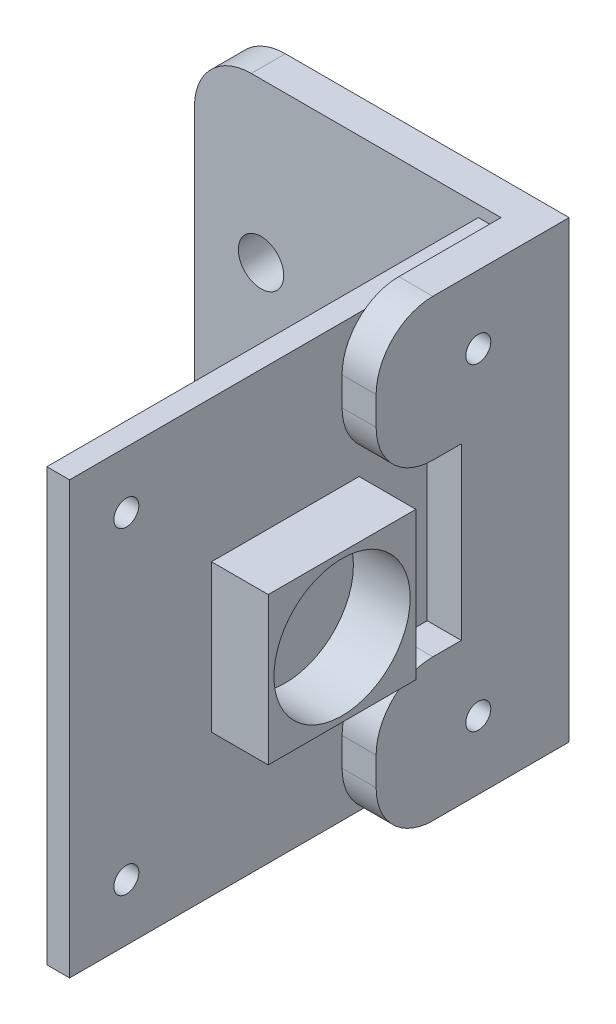
ISO-10303-21;
HEADER;
FILE_DESCRIPTION(('STEP AP214'),'2;1');
FILE_NAME('part.step','',(''),(''),'','','');
FILE_SCHEMA(('AUTOMOTIVE_DESIGN { 1 0 10303 214 1 1 1 1 }'));
ENDSEC;
DATA;
#1=APPLICATION_CONTEXT('core data for automotive mechanical design processes');
#2=APPLICATION_PROTOCOL_DEFINITION('international standard','automotive_design',2000,#1);
#3=PRODUCT_CONTEXT('',#1,'mechanical');
#4=PRODUCT('Part','Part','',(#3));
#5=PRODUCT_RELATED_PRODUCT_CATEGORY('part','',(#4));
#6=PRODUCT_DEFINITION_FORMATION('','',#4);
#7=PRODUCT_DEFINITION_CONTEXT('part definition',#1,'design');
#8=PRODUCT_DEFINITION('design','',#6,#7);
#9=PRODUCT_DEFINITION_SHAPE('','',#8);
#10=(LENGTH_UNIT() NAMED_UNIT(*) SI_UNIT(.MILLI.,.METRE.));
#11=(NAMED_UNIT(*) PLANE_ANGLE_UNIT() SI_UNIT($,.RADIAN.));
#12=(NAMED_UNIT(*) SI_UNIT($,.STERADIAN.) SOLID_ANGLE_UNIT());
#13=UNCERTAINTY_MEASURE_WITH_UNIT(LENGTH_MEASURE(1.E-05),#10,'distance_accuracy_value','');
#14=(GEOMETRIC_REPRESENTATION_CONTEXT(3) GLOBAL_UNCERTAINTY_ASSIGNED_CONTEXT((#13)) GLOBAL_UNIT_ASSIGNED_CONTEXT((#10,
#11,#12)) REPRESENTATION_CONTEXT('',''));
#15=CARTESIAN_POINT('',(0.,0.,0.));
#16=DIRECTION('',(0.,0.,1.));
#17=DIRECTION('',(1.,0.,0.));
#18=AXIS2_PLACEMENT_3D('',#15,#16,#17);
#19=CARTESIAN_POINT('',(5.,0.,-12.5));
#20=DIRECTION('',(0.,0.,-1.));
#21=DIRECTION('',(0.,1.,0.));
#22=AXIS2_PLACEMENT_3D('',#19,#20,#21);
#23=PLANE('',#22);
#24=DIRECTION('',(0.,-1.,0.));
#25=VECTOR('',#24,1.);
#26=CARTESIAN_POINT('',(2.,0.,-12.5));
#27=LINE('',#26,#25);
#28=CARTESIAN_POINT('',(2.,7.5,-12.5));
#29=VERTEX_POINT('',#28);
#30=CARTESIAN_POINT('',(2.,-7.5,-12.5));
#31=VERTEX_POINT('',#30);
#32=EDGE_CURVE('E258',#29,#31,#27,.T.);
#33=ORIENTED_EDGE('',*,*,#32,.T.);
#34=DIRECTION('',(-1.,0.,0.));
#35=VECTOR('',#34,1.);
#36=CARTESIAN_POINT('',(5.,-7.5,-12.5));
#37=LINE('',#36,#35);
#38=CARTESIAN_POINT('',(5.,-7.5,-12.5));
#39=VERTEX_POINT('',#38);
#40=EDGE_CURVE('E196',#39,#31,#37,.T.);
#41=ORIENTED_EDGE('',*,*,#40,.F.);
#42=DIRECTION('',(0.,-1.,0.));
#43=VECTOR('',#42,1.);
#44=CARTESIAN_POINT('',(5.,0.,-12.5));
#45=LINE('',#44,#43);
#46=CARTESIAN_POINT('',(5.,7.5,-12.5));
#47=VERTEX_POINT('',#46);
#48=EDGE_CURVE('E308',#47,#39,#45,.T.);
#49=ORIENTED_EDGE('',*,*,#48,.F.);
#50=DIRECTION('',(-1.,0.,0.));
#51=VECTOR('',#50,1.);
#52=CARTESIAN_POINT('',(5.,7.5,-12.5));
#53=LINE('',#52,#51);
#54=EDGE_CURVE('E268',#47,#29,#53,.T.);
#55=ORIENTED_EDGE('',*,*,#54,.T.);
#56=EDGE_LOOP('',(#33,#41,#49,#55));
#57=FACE_BOUND('',#56,.T.);
#58=ADVANCED_FACE('F53',(#57),#23,.F.);
#59=CARTESIAN_POINT('',(5.,-7.5,0.));
#60=DIRECTION('',(0.,-1.,0.));
#61=DIRECTION('',(0.,0.,-1.));
#62=AXIS2_PLACEMENT_3D('',#59,#60,#61);
#63=PLANE('',#62);
#64=DIRECTION('',(0.,0.,1.));
#65=VECTOR('',#64,1.);
#66=CARTESIAN_POINT('',(2.,-7.5,0.));
#67=LINE('',#66,#65);
#68=CARTESIAN_POINT('',(2.,-7.5,-10.));
#69=VERTEX_POINT('',#68);
#70=EDGE_CURVE('E328',#31,#69,#67,.T.);
#71=ORIENTED_EDGE('',*,*,#70,.T.);
#72=DIRECTION('',(-1.,0.,0.));
#73=VECTOR('',#72,1.);
#74=CARTESIAN_POINT('',(5.,-7.5,-10.));
#75=LINE('',#74,#73);
#76=CARTESIAN_POINT('',(5.,-7.5,-10.));
#77=VERTEX_POINT('',#76);
#78=EDGE_CURVE('E12',#69,#77,#75,.F.);
#79=ORIENTED_EDGE('',*,*,#78,.T.);
#80=DIRECTION('',(0.,0.,1.));
#81=VECTOR('',#80,1.);
#82=CARTESIAN_POINT('',(5.,-7.5,0.));
#83=LINE('',#82,#81);
#84=EDGE_CURVE('E311',#39,#77,#83,.T.);
#85=ORIENTED_EDGE('',*,*,#84,.F.);
#86=ORIENTED_EDGE('',*,*,#40,.T.);
#87=EDGE_LOOP('',(#71,#79,#85,#86));
#88=FACE_BOUND('',#87,.T.);
#89=ADVANCED_FACE('F351',(#88),#63,.F.);
#90=CARTESIAN_POINT('',(5.,0.,-5.));
#91=DIRECTION('',(0.,0.,1.));
#92=DIRECTION('',(1.,0.,0.));
#93=AXIS2_PLACEMENT_3D('',#90,#91,#92);
#94=PLANE('',#93);
#95=DIRECTION('',(0.,1.,0.));
#96=VECTOR('',#95,1.);
#97=CARTESIAN_POINT('',(2.,0.,-5.));
#98=LINE('',#97,#96);
#99=CARTESIAN_POINT('',(2.,-15.,-5.));
#100=VERTEX_POINT('',#99);
#101=CARTESIAN_POINT('',(2.,-12.5,-5.));
#102=VERTEX_POINT('',#101);
#103=EDGE_CURVE('E265',#100,#102,#98,.T.);
#104=ORIENTED_EDGE('',*,*,#103,.F.);
#105=DIRECTION('',(-1.,0.,0.));
#106=VECTOR('',#105,1.);
#107=CARTESIAN_POINT('',(5.,-15.,-5.));
#108=LINE('',#107,#106);
#109=CARTESIAN_POINT('',(5.,-15.,-5.));
#110=VERTEX_POINT('',#109);
#111=EDGE_CURVE('E233',#100,#110,#108,.F.);
#112=ORIENTED_EDGE('',*,*,#111,.T.);
#113=DIRECTION('',(0.,1.,0.));
#114=VECTOR('',#113,1.);
#115=CARTESIAN_POINT('',(5.,0.,-5.));
#116=LINE('',#115,#114);
#117=CARTESIAN_POINT('',(5.,-12.5,-5.));
#118=VERTEX_POINT('',#117);
#119=EDGE_CURVE('E313',#110,#118,#116,.T.);
#120=ORIENTED_EDGE('',*,*,#119,.T.);
#121=DIRECTION('',(-1.,0.,0.));
#122=VECTOR('',#121,1.);
#123=CARTESIAN_POINT('',(2.,-12.5,-5.));
#124=LINE('',#123,#122);
#125=EDGE_CURVE('E230',#118,#102,#124,.T.);
#126=ORIENTED_EDGE('',*,*,#125,.T.);
#127=EDGE_LOOP('',(#104,#112,#120,#126));
#128=FACE_BOUND('',#127,.T.);
#129=ADVANCED_FACE('F333',(#128),#94,.T.);
#130=CARTESIAN_POINT('',(5.,-20.,0.));
#131=DIRECTION('',(0.,1.,0.));
#132=DIRECTION('',(0.,0.,1.));
#133=AXIS2_PLACEMENT_3D('',#130,#131,#132);
#134=PLANE('',#133);
#135=DIRECTION('',(1.,0.,0.));
#136=VECTOR('',#135,1.);
#137=CARTESIAN_POINT('',(-25.,-20.,-19.));
#138=LINE('',#137,#136);
#139=CARTESIAN_POINT('',(-20.,-20.,-19.));
#140=VERTEX_POINT('',#139);
#141=CARTESIAN_POINT('',(2.,-20.,-19.));
#142=VERTEX_POINT('',#141);
#143=EDGE_CURVE('E188',#140,#142,#138,.T.);
#144=ORIENTED_EDGE('',*,*,#143,.F.);
#145=DIRECTION('',(0.,0.,-1.));
#146=VECTOR('',#145,1.);
#147=CARTESIAN_POINT('',(-20.,-20.,0.));
#148=LINE('',#147,#146);
#149=CARTESIAN_POINT('',(-20.,-20.,-22.));
#150=VERTEX_POINT('',#149);
#151=EDGE_CURVE('E199',#140,#150,#148,.T.);
#152=ORIENTED_EDGE('',*,*,#151,.T.);
#153=DIRECTION('',(-1.,0.,0.));
#154=VECTOR('',#153,1.);
#155=CARTESIAN_POINT('',(5.,-20.,-22.));
#156=LINE('',#155,#154);
#157=CARTESIAN_POINT('',(5.,-20.,-22.));
#158=VERTEX_POINT('',#157);
#159=EDGE_CURVE('E202',#158,#150,#156,.T.);
#160=ORIENTED_EDGE('',*,*,#159,.F.);
#161=DIRECTION('',(0.,0.,-1.));
#162=VECTOR('',#161,1.);
#163=CARTESIAN_POINT('',(5.,-20.,0.));
#164=LINE('',#163,#162);
#165=CARTESIAN_POINT('',(5.,-20.,-10.));
#166=VERTEX_POINT('',#165);
#167=EDGE_CURVE('E284',#166,#158,#164,.T.);
#168=ORIENTED_EDGE('',*,*,#167,.F.);
#169=DIRECTION('',(-1.,0.,0.));
#170=VECTOR('',#169,1.);
#171=CARTESIAN_POINT('',(2.,-20.,-10.));
#172=LINE('',#171,#170);
#173=CARTESIAN_POINT('',(2.,-20.,-10.));
#174=VERTEX_POINT('',#173);
#175=EDGE_CURVE('E195',#166,#174,#172,.T.);
#176=ORIENTED_EDGE('',*,*,#175,.T.);
#177=DIRECTION('',(0.,0.,-1.));
#178=VECTOR('',#177,1.);
#179=CARTESIAN_POINT('',(2.,-20.,0.));
#180=LINE('',#179,#178);
#181=EDGE_CURVE('E178',#174,#142,#180,.T.);
#182=ORIENTED_EDGE('',*,*,#181,.T.);
#183=EDGE_LOOP('',(#144,#152,#160,#168,#176,#182));
#184=FACE_BOUND('',#183,.T.);
#185=ADVANCED_FACE('F283',(#184),#134,.F.);
#186=CARTESIAN_POINT('',(5.,0.,-22.));
#187=DIRECTION('',(0.,0.,1.));
#188=DIRECTION('',(1.,0.,0.));
#189=AXIS2_PLACEMENT_3D('',#186,#187,#188);
#190=PLANE('',#189);
#191=CARTESIAN_POINT('',(-19.1350052544408,6.,-22.));
#192=DIRECTION('',(0.,0.,1.));
#193=DIRECTION('',(1.,0.,0.));
#194=AXIS2_PLACEMENT_3D('',#191,#192,#193);
#195=CIRCLE('',#194,2.);
#196=CARTESIAN_POINT('',(-17.1350052544408,6.,-22.));
#197=VERTEX_POINT('',#196);
#198=EDGE_CURVE('E296',#197,#197,#195,.T.);
#199=ORIENTED_EDGE('',*,*,#198,.T.);
#200=EDGE_LOOP('',(#199));
#201=FACE_BOUND('',#200,.T.);
#202=CARTESIAN_POINT('',(-19.1350052544408,-6.,-22.));
#203=DIRECTION('',(0.,0.,1.));
#204=DIRECTION('',(1.,0.,0.));
#205=AXIS2_PLACEMENT_3D('',#202,#203,#204);
#206=CIRCLE('',#205,2.);
#207=CARTESIAN_POINT('',(-17.1350052544408,-6.,-22.));
#208=VERTEX_POINT('',#207);
#209=EDGE_CURVE('E300',#208,#208,#206,.T.);
#210=ORIENTED_EDGE('',*,*,#209,.T.);
#211=EDGE_LOOP('',(#210));
#212=FACE_BOUND('',#211,.T.);
#213=ORIENTED_EDGE('',*,*,#159,.T.);
#214=CARTESIAN_POINT('',(-20.,-15.,-22.));
#215=DIRECTION('',(0.,0.,1.));
#216=DIRECTION('',(1.,0.,0.));
#217=AXIS2_PLACEMENT_3D('',#214,#215,#216);
#218=CIRCLE('',#217,5.);
#219=CARTESIAN_POINT('',(-25.,-15.,-22.));
#220=VERTEX_POINT('',#219);
#221=EDGE_CURVE('E210',#150,#220,#218,.F.);
#222=ORIENTED_EDGE('',*,*,#221,.T.);
#223=DIRECTION('',(0.,1.,0.));
#224=VECTOR('',#223,1.);
#225=CARTESIAN_POINT('',(-25.,20.,-22.));
#226=LINE('',#225,#224);
#227=CARTESIAN_POINT('',(-25.,15.,-22.));
#228=VERTEX_POINT('',#227);
#229=EDGE_CURVE('E189',#220,#228,#226,.T.);
#230=ORIENTED_EDGE('',*,*,#229,.T.);
#231=CARTESIAN_POINT('',(-20.,15.,-22.));
#232=DIRECTION('',(0.,0.,1.));
#233=DIRECTION('',(1.,0.,0.));
#234=AXIS2_PLACEMENT_3D('',#231,#232,#233);
#235=CIRCLE('',#234,5.);
#236=CARTESIAN_POINT('',(-20.,20.,-22.));
#237=VERTEX_POINT('',#236);
#238=EDGE_CURVE('E208',#228,#237,#235,.F.);
#239=ORIENTED_EDGE('',*,*,#238,.T.);
#240=DIRECTION('',(-1.,0.,0.));
#241=VECTOR('',#240,1.);
#242=CARTESIAN_POINT('',(5.,20.,-22.));
#243=LINE('',#242,#241);
#244=CARTESIAN_POINT('',(5.,20.,-22.));
#245=VERTEX_POINT('',#244);
#246=EDGE_CURVE('E270',#245,#237,#243,.T.);
#247=ORIENTED_EDGE('',*,*,#246,.F.);
#248=DIRECTION('',(0.,1.,0.));
#249=VECTOR('',#248,1.);
#250=CARTESIAN_POINT('',(5.,0.,-22.));
#251=LINE('',#250,#249);
#252=EDGE_CURVE('E280',#158,#245,#251,.T.);
#253=ORIENTED_EDGE('',*,*,#252,.F.);
#254=EDGE_LOOP('',(#213,#222,#230,#239,#247,#253));
#255=FACE_BOUND('',#254,.T.);
#256=ADVANCED_FACE('F275',(#201,#212,#255),#190,.F.);
#257=CARTESIAN_POINT('',(5.,20.,0.));
#258=DIRECTION('',(0.,1.,0.));
#259=DIRECTION('',(0.,0.,1.));
#260=AXIS2_PLACEMENT_3D('',#257,#258,#259);
#261=PLANE('',#260);
#262=ORIENTED_EDGE('',*,*,#246,.T.);
#263=DIRECTION('',(0.,0.,1.));
#264=VECTOR('',#263,1.);
#265=CARTESIAN_POINT('',(-20.,20.,-19.));
#266=LINE('',#265,#264);
#267=CARTESIAN_POINT('',(-20.,20.,-19.));
#268=VERTEX_POINT('',#267);
#269=EDGE_CURVE('E186',#237,#268,#266,.T.);
#270=ORIENTED_EDGE('',*,*,#269,.T.);
#271=DIRECTION('',(1.,0.,0.));
#272=VECTOR('',#271,1.);
#273=CARTESIAN_POINT('',(-25.,20.,-19.));
#274=LINE('',#273,#272);
#275=CARTESIAN_POINT('',(2.,20.,-19.));
#276=VERTEX_POINT('',#275);
#277=EDGE_CURVE('E182',#268,#276,#274,.T.);
#278=ORIENTED_EDGE('',*,*,#277,.T.);
#279=DIRECTION('',(0.,0.,-1.));
#280=VECTOR('',#279,1.);
#281=CARTESIAN_POINT('',(2.,20.,0.));
#282=LINE('',#281,#280);
#283=CARTESIAN_POINT('',(2.,20.,-10.));
#284=VERTEX_POINT('',#283);
#285=EDGE_CURVE('E167',#284,#276,#282,.T.);
#286=ORIENTED_EDGE('',*,*,#285,.F.);
#287=DIRECTION('',(-1.,0.,0.));
#288=VECTOR('',#287,1.);
#289=CARTESIAN_POINT('',(5.,20.,-10.));
#290=LINE('',#289,#288);
#291=CARTESIAN_POINT('',(5.,20.,-10.));
#292=VERTEX_POINT('',#291);
#293=EDGE_CURVE('E220',#284,#292,#290,.F.);
#294=ORIENTED_EDGE('',*,*,#293,.T.);
#295=DIRECTION('',(0.,0.,-1.));
#296=VECTOR('',#295,1.);
#297=CARTESIAN_POINT('',(5.,20.,0.));
#298=LINE('',#297,#296);
#299=EDGE_CURVE('E317',#292,#245,#298,.T.);
#300=ORIENTED_EDGE('',*,*,#299,.T.);
#301=EDGE_LOOP('',(#262,#270,#278,#286,#294,#300));
#302=FACE_BOUND('',#301,.T.);
#303=ADVANCED_FACE('F184',(#302),#261,.T.);
#304=CARTESIAN_POINT('',(5.,12.5,-5.));
#305=VERTEX_POINT('',#304);
#306=CARTESIAN_POINT('',(5.,15.,-5.));
#307=VERTEX_POINT('',#306);
#308=EDGE_CURVE('E314',#305,#307,#116,.T.);
#309=ORIENTED_EDGE('',*,*,#308,.T.);
#310=DIRECTION('',(-1.,0.,0.));
#311=VECTOR('',#310,1.);
#312=CARTESIAN_POINT('',(5.,15.,-5.));
#313=LINE('',#312,#311);
#314=CARTESIAN_POINT('',(2.,15.,-5.));
#315=VERTEX_POINT('',#314);
#316=EDGE_CURVE('E244',#307,#315,#313,.T.);
#317=ORIENTED_EDGE('',*,*,#316,.T.);
#318=CARTESIAN_POINT('',(2.,12.5,-5.));
#319=VERTEX_POINT('',#318);
#320=EDGE_CURVE('E177',#319,#315,#98,.T.);
#321=ORIENTED_EDGE('',*,*,#320,.F.);
#322=DIRECTION('',(-1.,0.,0.));
#323=VECTOR('',#322,1.);
#324=CARTESIAN_POINT('',(5.,12.5,-5.));
#325=LINE('',#324,#323);
#326=EDGE_CURVE('E242',#319,#305,#325,.F.);
#327=ORIENTED_EDGE('',*,*,#326,.T.);
#328=EDGE_LOOP('',(#309,#317,#321,#327));
#329=FACE_BOUND('',#328,.T.);
#330=ADVANCED_FACE('F364',(#329),#94,.T.);
#331=CARTESIAN_POINT('',(5.,14.,-14.));
#332=DIRECTION('',(-1.,0.,0.));
#333=DIRECTION('',(0.,0.,1.));
#334=AXIS2_PLACEMENT_3D('',#331,#332,#333);
#335=CYLINDRICAL_SURFACE('',#334,1.1);
#336=CARTESIAN_POINT('',(5.,14.,-14.));
#337=DIRECTION('',(1.,0.,0.));
#338=DIRECTION('',(0.,0.,-1.));
#339=AXIS2_PLACEMENT_3D('',#336,#337,#338);
#340=CIRCLE('',#339,1.1);
#341=CARTESIAN_POINT('',(5.,14.,-15.1));
#342=VERTEX_POINT('',#341);
#343=EDGE_CURVE('E262',#342,#342,#340,.F.);
#344=ORIENTED_EDGE('',*,*,#343,.F.);
#345=EDGE_LOOP('',(#344));
#346=FACE_BOUND('',#345,.T.);
#347=CARTESIAN_POINT('',(2.,14.,-14.));
#348=DIRECTION('',(1.,0.,0.));
#349=DIRECTION('',(0.,0.,-1.));
#350=AXIS2_PLACEMENT_3D('',#347,#348,#349);
#351=CIRCLE('',#350,1.1);
#352=CARTESIAN_POINT('',(2.,14.,-15.1));
#353=VERTEX_POINT('',#352);
#354=EDGE_CURVE('E324',#353,#353,#351,.F.);
#355=ORIENTED_EDGE('',*,*,#354,.T.);
#356=EDGE_LOOP('',(#355));
#357=FACE_BOUND('',#356,.T.);
#358=ADVANCED_FACE('F361',(#346,#357),#335,.F.);
#359=CARTESIAN_POINT('',(5.,-14.,-14.));
#360=DIRECTION('',(-1.,0.,0.));
#361=DIRECTION('',(0.,0.,1.));
#362=AXIS2_PLACEMENT_3D('',#359,#360,#361);
#363=CYLINDRICAL_SURFACE('',#362,1.1);
#364=CARTESIAN_POINT('',(5.,-14.,-14.));
#365=DIRECTION('',(1.,0.,0.));
#366=DIRECTION('',(0.,0.,-1.));
#367=AXIS2_PLACEMENT_3D('',#364,#365,#366);
#368=CIRCLE('',#367,1.1);
#369=CARTESIAN_POINT('',(5.,-14.,-15.1));
#370=VERTEX_POINT('',#369);
#371=EDGE_CURVE('E259',#370,#370,#368,.F.);
#372=ORIENTED_EDGE('',*,*,#371,.F.);
#373=EDGE_LOOP('',(#372));
#374=FACE_BOUND('',#373,.T.);
#375=CARTESIAN_POINT('',(2.,-14.,-14.));
#376=DIRECTION('',(1.,0.,0.));
#377=DIRECTION('',(0.,0.,-1.));
#378=AXIS2_PLACEMENT_3D('',#375,#376,#377);
#379=CIRCLE('',#378,1.1);
#380=CARTESIAN_POINT('',(2.,-14.,-15.1));
#381=VERTEX_POINT('',#380);
#382=EDGE_CURVE('E304',#381,#381,#379,.F.);
#383=ORIENTED_EDGE('',*,*,#382,.T.);
#384=EDGE_LOOP('',(#383));
#385=FACE_BOUND('',#384,.T.);
#386=ADVANCED_FACE('F363',(#374,#385),#363,.F.);
#387=CARTESIAN_POINT('',(5.,7.5,0.));
#388=DIRECTION('',(0.,-1.,0.));
#389=DIRECTION('',(0.,0.,-1.));
#390=AXIS2_PLACEMENT_3D('',#387,#388,#389);
#391=PLANE('',#390);
#392=DIRECTION('',(0.,0.,1.));
#393=VECTOR('',#392,1.);
#394=CARTESIAN_POINT('',(5.,7.5,0.));
#395=LINE('',#394,#393);
#396=CARTESIAN_POINT('',(5.,7.5,-10.));
#397=VERTEX_POINT('',#396);
#398=EDGE_CURVE('E253',#47,#397,#395,.T.);
#399=ORIENTED_EDGE('',*,*,#398,.T.);
#400=DIRECTION('',(-1.,0.,0.));
#401=VECTOR('',#400,1.);
#402=CARTESIAN_POINT('',(5.,7.5,-10.));
#403=LINE('',#402,#401);
#404=CARTESIAN_POINT('',(2.,7.5,-10.));
#405=VERTEX_POINT('',#404);
#406=EDGE_CURVE('E61',#397,#405,#403,.T.);
#407=ORIENTED_EDGE('',*,*,#406,.T.);
#408=DIRECTION('',(0.,0.,1.));
#409=VECTOR('',#408,1.);
#410=CARTESIAN_POINT('',(2.,7.5,0.));
#411=LINE('',#410,#409);
#412=EDGE_CURVE('E252',#29,#405,#411,.T.);
#413=ORIENTED_EDGE('',*,*,#412,.F.);
#414=ORIENTED_EDGE('',*,*,#54,.F.);
#415=EDGE_LOOP('',(#399,#407,#413,#414));
#416=FACE_BOUND('',#415,.T.);
#417=ADVANCED_FACE('F251',(#416),#391,.T.);
#418=CARTESIAN_POINT('',(5.,0.,0.));
#419=DIRECTION('',(1.,0.,0.));
#420=DIRECTION('',(0.,0.,-1.));
#421=AXIS2_PLACEMENT_3D('',#418,#419,#420);
#422=PLANE('',#421);
#423=ORIENTED_EDGE('',*,*,#119,.F.);
#424=CARTESIAN_POINT('',(5.,-15.,-10.));
#425=DIRECTION('',(1.,0.,0.));
#426=DIRECTION('',(0.,0.,-1.));
#427=AXIS2_PLACEMENT_3D('',#424,#425,#426);
#428=CIRCLE('',#427,5.);
#429=EDGE_CURVE('E240',#110,#166,#428,.T.);
#430=ORIENTED_EDGE('',*,*,#429,.T.);
#431=ORIENTED_EDGE('',*,*,#167,.T.);
#432=ORIENTED_EDGE('',*,*,#252,.T.);
#433=ORIENTED_EDGE('',*,*,#299,.F.);
#434=CARTESIAN_POINT('',(5.,15.,-10.));
#435=DIRECTION('',(1.,0.,0.));
#436=DIRECTION('',(0.,0.,-1.));
#437=AXIS2_PLACEMENT_3D('',#434,#435,#436);
#438=CIRCLE('',#437,5.);
#439=EDGE_CURVE('E238',#292,#307,#438,.T.);
#440=ORIENTED_EDGE('',*,*,#439,.T.);
#441=ORIENTED_EDGE('',*,*,#308,.F.);
#442=CARTESIAN_POINT('',(5.,12.5,-10.));
#443=DIRECTION('',(1.,0.,0.));
#444=DIRECTION('',(0.,0.,-1.));
#445=AXIS2_PLACEMENT_3D('',#442,#443,#444);
#446=CIRCLE('',#445,5.);
#447=EDGE_CURVE('E74',#305,#397,#446,.T.);
#448=ORIENTED_EDGE('',*,*,#447,.T.);
#449=ORIENTED_EDGE('',*,*,#398,.F.);
#450=ORIENTED_EDGE('',*,*,#48,.T.);
#451=ORIENTED_EDGE('',*,*,#84,.T.);
#452=CARTESIAN_POINT('',(5.,-12.5,-10.));
#453=DIRECTION('',(1.,0.,0.));
#454=DIRECTION('',(0.,0.,-1.));
#455=AXIS2_PLACEMENT_3D('',#452,#453,#454);
#456=CIRCLE('',#455,5.);
#457=EDGE_CURVE('E235',#77,#118,#456,.T.);
#458=ORIENTED_EDGE('',*,*,#457,.T.);
#459=EDGE_LOOP('',(#423,#430,#431,#432,#433,#440,#441,#448,#449,#450,#451,#458));
#460=FACE_BOUND('',#459,.T.);
#461=ORIENTED_EDGE('',*,*,#371,.T.);
#462=EDGE_LOOP('',(#461));
#463=FACE_BOUND('',#462,.T.);
#464=ORIENTED_EDGE('',*,*,#343,.T.);
#465=EDGE_LOOP('',(#464));
#466=FACE_BOUND('',#465,.T.);
#467=ADVANCED_FACE('F340',(#460,#463,#466),#422,.T.);
#468=CARTESIAN_POINT('',(2.,0.,0.));
#469=DIRECTION('',(1.,0.,0.));
#470=DIRECTION('',(0.,0.,-1.));
#471=AXIS2_PLACEMENT_3D('',#468,#469,#470);
#472=PLANE('',#471);
#473=ORIENTED_EDGE('',*,*,#382,.F.);
#474=EDGE_LOOP('',(#473));
#475=FACE_BOUND('',#474,.T.);
#476=ORIENTED_EDGE('',*,*,#354,.F.);
#477=EDGE_LOOP('',(#476));
#478=FACE_BOUND('',#477,.T.);
#479=ORIENTED_EDGE('',*,*,#181,.F.);
#480=CARTESIAN_POINT('',(2.,-15.,-10.));
#481=DIRECTION('',(1.,0.,0.));
#482=DIRECTION('',(0.,0.,-1.));
#483=AXIS2_PLACEMENT_3D('',#480,#481,#482);
#484=CIRCLE('',#483,5.);
#485=EDGE_CURVE('E228',#174,#100,#484,.F.);
#486=ORIENTED_EDGE('',*,*,#485,.T.);
#487=ORIENTED_EDGE('',*,*,#103,.T.);
#488=CARTESIAN_POINT('',(2.,-12.5,-10.));
#489=DIRECTION('',(1.,0.,0.));
#490=DIRECTION('',(0.,0.,-1.));
#491=AXIS2_PLACEMENT_3D('',#488,#489,#490);
#492=CIRCLE('',#491,5.);
#493=EDGE_CURVE('E223',#102,#69,#492,.F.);
#494=ORIENTED_EDGE('',*,*,#493,.T.);
#495=ORIENTED_EDGE('',*,*,#70,.F.);
#496=ORIENTED_EDGE('',*,*,#32,.F.);
#497=ORIENTED_EDGE('',*,*,#412,.T.);
#498=CARTESIAN_POINT('',(2.,12.5,-10.));
#499=DIRECTION('',(1.,0.,0.));
#500=DIRECTION('',(0.,0.,-1.));
#501=AXIS2_PLACEMENT_3D('',#498,#499,#500);
#502=CIRCLE('',#501,5.);
#503=EDGE_CURVE('E225',#405,#319,#502,.F.);
#504=ORIENTED_EDGE('',*,*,#503,.T.);
#505=ORIENTED_EDGE('',*,*,#320,.T.);
#506=CARTESIAN_POINT('',(2.,15.,-10.));
#507=DIRECTION('',(1.,0.,0.));
#508=DIRECTION('',(0.,0.,-1.));
#509=AXIS2_PLACEMENT_3D('',#506,#507,#508);
#510=CIRCLE('',#509,5.);
#511=EDGE_CURVE('E174',#315,#284,#510,.F.);
#512=ORIENTED_EDGE('',*,*,#511,.T.);
#513=ORIENTED_EDGE('',*,*,#285,.T.);
#514=DIRECTION('',(0.,-1.,0.));
#515=VECTOR('',#514,1.);
#516=CARTESIAN_POINT('',(2.,0.,-19.));
#517=LINE('',#516,#515);
#518=EDGE_CURVE('E172',#276,#142,#517,.T.);
#519=ORIENTED_EDGE('',*,*,#518,.T.);
#520=EDGE_LOOP('',(#479,#486,#487,#494,#495,#496,#497,#504,#505,#512,#513,#519));
#521=FACE_BOUND('',#520,.T.);
#522=ADVANCED_FACE('F170',(#475,#478,#521),#472,.F.);
#523=CARTESIAN_POINT('',(-25.,20.,-19.));
#524=DIRECTION('',(0.,0.,1.));
#525=DIRECTION('',(0.,-1.,0.));
#526=AXIS2_PLACEMENT_3D('',#523,#524,#525);
#527=PLANE('',#526);
#528=CARTESIAN_POINT('',(-19.1350052544408,6.,-19.));
#529=DIRECTION('',(0.,0.,1.));
#530=DIRECTION('',(1.,0.,0.));
#531=AXIS2_PLACEMENT_3D('',#528,#529,#530);
#532=CIRCLE('',#531,2.);
#533=CARTESIAN_POINT('',(-17.1350052544408,6.,-19.));
#534=VERTEX_POINT('',#533);
#535=EDGE_CURVE('E411',#534,#534,#532,.T.);
#536=ORIENTED_EDGE('',*,*,#535,.F.);
#537=EDGE_LOOP('',(#536));
#538=FACE_BOUND('',#537,.T.);
#539=CARTESIAN_POINT('',(-19.1350052544408,-6.,-19.));
#540=DIRECTION('',(0.,0.,1.));
#541=DIRECTION('',(1.,0.,0.));
#542=AXIS2_PLACEMENT_3D('',#539,#540,#541);
#543=CIRCLE('',#542,2.);
#544=CARTESIAN_POINT('',(-17.1350052544408,-6.,-19.));
#545=VERTEX_POINT('',#544);
#546=EDGE_CURVE('E413',#545,#545,#543,.T.);
#547=ORIENTED_EDGE('',*,*,#546,.F.);
#548=EDGE_LOOP('',(#547));
#549=FACE_BOUND('',#548,.T.);
#550=DIRECTION('',(0.,-1.,0.));
#551=VECTOR('',#550,1.);
#552=CARTESIAN_POINT('',(-25.,20.,-19.));
#553=LINE('',#552,#551);
#554=CARTESIAN_POINT('',(-25.,15.,-19.));
#555=VERTEX_POINT('',#554);
#556=CARTESIAN_POINT('',(-25.,-15.,-19.));
#557=VERTEX_POINT('',#556);
#558=EDGE_CURVE('E294',#555,#557,#553,.T.);
#559=ORIENTED_EDGE('',*,*,#558,.T.);
#560=CARTESIAN_POINT('',(-20.,-15.,-19.));
#561=DIRECTION('',(0.,0.,1.));
#562=DIRECTION('',(0.,-1.,0.));
#563=AXIS2_PLACEMENT_3D('',#560,#561,#562);
#564=CIRCLE('',#563,5.);
#565=EDGE_CURVE('E218',#557,#140,#564,.T.);
#566=ORIENTED_EDGE('',*,*,#565,.T.);
#567=ORIENTED_EDGE('',*,*,#143,.T.);
#568=ORIENTED_EDGE('',*,*,#518,.F.);
#569=ORIENTED_EDGE('',*,*,#277,.F.);
#570=CARTESIAN_POINT('',(-20.,15.,-19.));
#571=DIRECTION('',(0.,0.,1.));
#572=DIRECTION('',(0.,-1.,0.));
#573=AXIS2_PLACEMENT_3D('',#570,#571,#572);
#574=CIRCLE('',#573,5.);
#575=EDGE_CURVE('E216',#268,#555,#574,.T.);
#576=ORIENTED_EDGE('',*,*,#575,.T.);
#577=EDGE_LOOP('',(#559,#566,#567,#568,#569,#576));
#578=FACE_BOUND('',#577,.T.);
#579=ADVANCED_FACE('F192',(#538,#549,#578),#527,.T.);
#580=CARTESIAN_POINT('',(-25.,0.,0.));
#581=DIRECTION('',(1.,0.,0.));
#582=DIRECTION('',(0.,0.,-1.));
#583=AXIS2_PLACEMENT_3D('',#580,#581,#582);
#584=PLANE('',#583);
#585=ORIENTED_EDGE('',*,*,#229,.F.);
#586=DIRECTION('',(0.,0.,-1.));
#587=VECTOR('',#586,1.);
#588=CARTESIAN_POINT('',(-25.,-15.,0.));
#589=LINE('',#588,#587);
#590=EDGE_CURVE('E214',#220,#557,#589,.F.);
#591=ORIENTED_EDGE('',*,*,#590,.T.);
#592=ORIENTED_EDGE('',*,*,#558,.F.);
#593=DIRECTION('',(0.,0.,1.));
#594=VECTOR('',#593,1.);
#595=CARTESIAN_POINT('',(-25.,15.,-22.));
#596=LINE('',#595,#594);
#597=EDGE_CURVE('E212',#555,#228,#596,.F.);
#598=ORIENTED_EDGE('',*,*,#597,.T.);
#599=EDGE_LOOP('',(#585,#591,#592,#598));
#600=FACE_BOUND('',#599,.T.);
#601=ADVANCED_FACE('F293',(#600),#584,.F.);
#602=CARTESIAN_POINT('',(-19.1350052544408,-6.,-29.));
#603=DIRECTION('',(0.,0.,1.));
#604=DIRECTION('',(1.,0.,0.));
#605=AXIS2_PLACEMENT_3D('',#602,#603,#604);
#606=CYLINDRICAL_SURFACE('',#605,2.);
#607=ORIENTED_EDGE('',*,*,#546,.T.);
#608=EDGE_LOOP('',(#607));
#609=FACE_BOUND('',#608,.T.);
#610=ORIENTED_EDGE('',*,*,#209,.F.);
#611=EDGE_LOOP('',(#610));
#612=FACE_BOUND('',#611,.T.);
#613=ADVANCED_FACE('F419',(#609,#612),#606,.F.);
#614=CARTESIAN_POINT('',(-19.1350052544408,6.,-29.));
#615=DIRECTION('',(0.,0.,1.));
#616=DIRECTION('',(1.,0.,0.));
#617=AXIS2_PLACEMENT_3D('',#614,#615,#616);
#618=CYLINDRICAL_SURFACE('',#617,2.);
#619=ORIENTED_EDGE('',*,*,#535,.T.);
#620=EDGE_LOOP('',(#619));
#621=FACE_BOUND('',#620,.T.);
#622=ORIENTED_EDGE('',*,*,#198,.F.);
#623=EDGE_LOOP('',(#622));
#624=FACE_BOUND('',#623,.T.);
#625=ADVANCED_FACE('F372',(#621,#624),#618,.F.);
#626=CARTESIAN_POINT('',(-20.,-15.,0.));
#627=DIRECTION('',(0.,0.,-1.));
#628=DIRECTION('',(0.,1.,0.));
#629=AXIS2_PLACEMENT_3D('',#626,#627,#628);
#630=CYLINDRICAL_SURFACE('',#629,5.);
#631=ORIENTED_EDGE('',*,*,#565,.F.);
#632=ORIENTED_EDGE('',*,*,#590,.F.);
#633=ORIENTED_EDGE('',*,*,#221,.F.);
#634=ORIENTED_EDGE('',*,*,#151,.F.);
#635=EDGE_LOOP('',(#631,#632,#633,#634));
#636=FACE_BOUND('',#635,.T.);
#637=ADVANCED_FACE('F289',(#636),#630,.T.);
#638=CARTESIAN_POINT('',(-20.,15.,0.));
#639=DIRECTION('',(0.,0.,-1.));
#640=DIRECTION('',(0.,1.,0.));
#641=AXIS2_PLACEMENT_3D('',#638,#639,#640);
#642=CYLINDRICAL_SURFACE('',#641,5.);
#643=ORIENTED_EDGE('',*,*,#238,.F.);
#644=ORIENTED_EDGE('',*,*,#597,.F.);
#645=ORIENTED_EDGE('',*,*,#575,.F.);
#646=ORIENTED_EDGE('',*,*,#269,.F.);
#647=EDGE_LOOP('',(#643,#644,#645,#646));
#648=FACE_BOUND('',#647,.T.);
#649=ADVANCED_FACE('F371',(#648),#642,.T.);
#650=CARTESIAN_POINT('',(5.,-15.,-10.));
#651=DIRECTION('',(1.,0.,0.));
#652=DIRECTION('',(0.,0.,-1.));
#653=AXIS2_PLACEMENT_3D('',#650,#651,#652);
#654=CYLINDRICAL_SURFACE('',#653,5.);
#655=ORIENTED_EDGE('',*,*,#429,.F.);
#656=ORIENTED_EDGE('',*,*,#111,.F.);
#657=ORIENTED_EDGE('',*,*,#485,.F.);
#658=ORIENTED_EDGE('',*,*,#175,.F.);
#659=EDGE_LOOP('',(#655,#656,#657,#658));
#660=FACE_BOUND('',#659,.T.);
#661=ADVANCED_FACE('F339',(#660),#654,.T.);
#662=CARTESIAN_POINT('',(5.,15.,-10.));
#663=DIRECTION('',(-1.,0.,0.));
#664=DIRECTION('',(0.,0.,1.));
#665=AXIS2_PLACEMENT_3D('',#662,#663,#664);
#666=CYLINDRICAL_SURFACE('',#665,5.);
#667=ORIENTED_EDGE('',*,*,#439,.F.);
#668=ORIENTED_EDGE('',*,*,#293,.F.);
#669=ORIENTED_EDGE('',*,*,#511,.F.);
#670=ORIENTED_EDGE('',*,*,#316,.F.);
#671=EDGE_LOOP('',(#667,#668,#669,#670));
#672=FACE_BOUND('',#671,.T.);
#673=ADVANCED_FACE('F349',(#672),#666,.T.);
#674=CARTESIAN_POINT('',(5.,12.5,-10.));
#675=DIRECTION('',(-1.,0.,0.));
#676=DIRECTION('',(0.,0.,1.));
#677=AXIS2_PLACEMENT_3D('',#674,#675,#676);
#678=CYLINDRICAL_SURFACE('',#677,5.);
#679=ORIENTED_EDGE('',*,*,#447,.F.);
#680=ORIENTED_EDGE('',*,*,#326,.F.);
#681=ORIENTED_EDGE('',*,*,#503,.F.);
#682=ORIENTED_EDGE('',*,*,#406,.F.);
#683=EDGE_LOOP('',(#679,#680,#681,#682));
#684=FACE_BOUND('',#683,.T.);
#685=ADVANCED_FACE('F345',(#684),#678,.T.);
#686=CARTESIAN_POINT('',(5.,-12.5,-10.));
#687=DIRECTION('',(1.,0.,0.));
#688=DIRECTION('',(0.,0.,-1.));
#689=AXIS2_PLACEMENT_3D('',#686,#687,#688);
#690=CYLINDRICAL_SURFACE('',#689,5.);
#691=ORIENTED_EDGE('',*,*,#457,.F.);
#692=ORIENTED_EDGE('',*,*,#78,.F.);
#693=ORIENTED_EDGE('',*,*,#493,.F.);
#694=ORIENTED_EDGE('',*,*,#125,.F.);
#695=EDGE_LOOP('',(#691,#692,#693,#694));
#696=FACE_BOUND('',#695,.T.);
#697=ADVANCED_FACE('F55',(#696),#690,.T.);
#698=CLOSED_SHELL('',(#58,#89,#129,#185,#256,#303,#330,#358,#386,#417,#467,#522,#579,#601,#613,
#625,#637,#649,#661,#673,#685,#697));
#699=MANIFOLD_SOLID_BREP('B2',#698);
#700=CARTESIAN_POINT('',(2.,0.,0.));
#701=DIRECTION('',(-1.,0.,0.));
#702=DIRECTION('',(0.,0.,1.));
#703=AXIS2_PLACEMENT_3D('',#700,#701,#702);
#704=PLANE('',#703);
#705=CARTESIAN_POINT('',(2.,14.,14.));
#706=DIRECTION('',(1.,0.,0.));
#707=DIRECTION('',(0.,0.,1.));
#708=AXIS2_PLACEMENT_3D('',#705,#706,#707);
#709=CIRCLE('',#708,1.1);
#710=CARTESIAN_POINT('',(2.,14.,15.1));
#711=VERTEX_POINT('',#710);
#712=EDGE_CURVE('E719',#711,#711,#709,.T.);
#713=ORIENTED_EDGE('',*,*,#712,.F.);
#714=EDGE_LOOP('',(#713));
#715=FACE_BOUND('',#714,.T.);
#716=CARTESIAN_POINT('',(2.,-14.,-14.));
#717=DIRECTION('',(1.,0.,0.));
#718=DIRECTION('',(0.,0.,1.));
#719=AXIS2_PLACEMENT_3D('',#716,#717,#718);
#720=CIRCLE('',#719,1.1);
#721=CARTESIAN_POINT('',(2.,-14.,-12.9));
#722=VERTEX_POINT('',#721);
#723=EDGE_CURVE('E725',#722,#722,#720,.T.);
#724=ORIENTED_EDGE('',*,*,#723,.F.);
#725=EDGE_LOOP('',(#724));
#726=FACE_BOUND('',#725,.T.);
#727=CARTESIAN_POINT('',(2.,14.,-14.));
#728=DIRECTION('',(1.,0.,0.));
#729=DIRECTION('',(0.,0.,-1.));
#730=AXIS2_PLACEMENT_3D('',#727,#728,#729);
#731=CIRCLE('',#730,1.1);
#732=CARTESIAN_POINT('',(2.,14.,-15.1));
#733=VERTEX_POINT('',#732);
#734=EDGE_CURVE('E731',#733,#733,#731,.T.);
#735=ORIENTED_EDGE('',*,*,#734,.F.);
#736=EDGE_LOOP('',(#735));
#737=FACE_BOUND('',#736,.T.);
#738=CARTESIAN_POINT('',(2.,-14.,14.));
#739=DIRECTION('',(1.,0.,0.));
#740=DIRECTION('',(0.,0.,-1.));
#741=AXIS2_PLACEMENT_3D('',#738,#739,#740);
#742=CIRCLE('',#741,1.1);
#743=CARTESIAN_POINT('',(2.,-14.,12.9));
#744=VERTEX_POINT('',#743);
#745=EDGE_CURVE('E737',#744,#744,#742,.T.);
#746=ORIENTED_EDGE('',*,*,#745,.F.);
#747=EDGE_LOOP('',(#746));
#748=FACE_BOUND('',#747,.T.);
#749=DIRECTION('',(0.,0.,1.));
#750=VECTOR('',#749,1.);
#751=CARTESIAN_POINT('',(2.,19.,-19.));
#752=LINE('',#751,#750);
#753=CARTESIAN_POINT('',(2.,19.,-19.));
#754=VERTEX_POINT('',#753);
#755=CARTESIAN_POINT('',(2.,19.,19.));
#756=VERTEX_POINT('',#755);
#757=EDGE_CURVE('E743',#754,#756,#752,.T.);
#758=ORIENTED_EDGE('',*,*,#757,.T.);
#759=DIRECTION('',(0.,-1.,0.));
#760=VECTOR('',#759,1.);
#761=CARTESIAN_POINT('',(2.,-19.,19.));
#762=LINE('',#761,#760);
#763=CARTESIAN_POINT('',(2.,-19.,19.));
#764=VERTEX_POINT('',#763);
#765=EDGE_CURVE('E649',#756,#764,#762,.T.);
#766=ORIENTED_EDGE('',*,*,#765,.T.);
#767=DIRECTION('',(0.,0.,-1.));
#768=VECTOR('',#767,1.);
#769=CARTESIAN_POINT('',(2.,-19.,-19.));
#770=LINE('',#769,#768);
#771=CARTESIAN_POINT('',(2.,-19.,-19.));
#772=VERTEX_POINT('',#771);
#773=EDGE_CURVE('E746',#764,#772,#770,.T.);
#774=ORIENTED_EDGE('',*,*,#773,.T.);
#775=DIRECTION('',(0.,1.,0.));
#776=VECTOR('',#775,1.);
#777=CARTESIAN_POINT('',(2.,-19.,-19.));
#778=LINE('',#777,#776);
#779=EDGE_CURVE('E621',#772,#754,#778,.T.);
#780=ORIENTED_EDGE('',*,*,#779,.T.);
#781=EDGE_LOOP('',(#758,#766,#774,#780));
#782=FACE_BOUND('',#781,.T.);
#783=DIRECTION('',(0.,1.,0.));
#784=VECTOR('',#783,1.);
#785=CARTESIAN_POINT('',(2.,0.,-6.5));
#786=LINE('',#785,#784);
#787=CARTESIAN_POINT('',(2.,-6.5,-6.5));
#788=VERTEX_POINT('',#787);
#789=CARTESIAN_POINT('',(2.,6.5,-6.5));
#790=VERTEX_POINT('',#789);
#791=EDGE_CURVE('E710',#788,#790,#786,.T.);
#792=ORIENTED_EDGE('',*,*,#791,.F.);
#793=DIRECTION('',(0.,0.,1.));
#794=VECTOR('',#793,1.);
#795=CARTESIAN_POINT('',(2.,-6.5,0.));
#796=LINE('',#795,#794);
#797=CARTESIAN_POINT('',(2.,-6.5,6.5));
#798=VERTEX_POINT('',#797);
#799=EDGE_CURVE('E680',#788,#798,#796,.T.);
#800=ORIENTED_EDGE('',*,*,#799,.T.);
#801=DIRECTION('',(0.,1.,0.));
#802=VECTOR('',#801,1.);
#803=CARTESIAN_POINT('',(2.,0.,6.5));
#804=LINE('',#803,#802);
#805=CARTESIAN_POINT('',(2.,6.5,6.5));
#806=VERTEX_POINT('',#805);
#807=EDGE_CURVE('E700',#798,#806,#804,.T.);
#808=ORIENTED_EDGE('',*,*,#807,.T.);
#809=DIRECTION('',(0.,0.,1.));
#810=VECTOR('',#809,1.);
#811=CARTESIAN_POINT('',(2.,6.5,0.));
#812=LINE('',#811,#810);
#813=EDGE_CURVE('E612',#790,#806,#812,.T.);
#814=ORIENTED_EDGE('',*,*,#813,.F.);
#815=EDGE_LOOP('',(#792,#800,#808,#814));
#816=FACE_BOUND('',#815,.T.);
#817=ADVANCED_FACE('F597',(#715,#726,#737,#748,#782,#816),#704,.F.);
#818=CARTESIAN_POINT('',(0.,0.,0.));
#819=DIRECTION('',(-1.,0.,0.));
#820=DIRECTION('',(0.,0.,1.));
#821=AXIS2_PLACEMENT_3D('',#818,#819,#820);
#822=PLANE('',#821);
#823=CARTESIAN_POINT('',(0.,-14.,-14.));
#824=DIRECTION('',(1.,0.,0.));
#825=DIRECTION('',(0.,0.,1.));
#826=AXIS2_PLACEMENT_3D('',#823,#824,#825);
#827=CIRCLE('',#826,1.1);
#828=CARTESIAN_POINT('',(0.,-14.,-12.9));
#829=VERTEX_POINT('',#828);
#830=EDGE_CURVE('E722',#829,#829,#827,.T.);
#831=ORIENTED_EDGE('',*,*,#830,.T.);
#832=EDGE_LOOP('',(#831));
#833=FACE_BOUND('',#832,.T.);
#834=CARTESIAN_POINT('',(0.,-14.,14.));
#835=DIRECTION('',(1.,0.,0.));
#836=DIRECTION('',(0.,0.,-1.));
#837=AXIS2_PLACEMENT_3D('',#834,#835,#836);
#838=CIRCLE('',#837,1.1);
#839=CARTESIAN_POINT('',(0.,-14.,12.9));
#840=VERTEX_POINT('',#839);
#841=EDGE_CURVE('E734',#840,#840,#838,.T.);
#842=ORIENTED_EDGE('',*,*,#841,.T.);
#843=EDGE_LOOP('',(#842));
#844=FACE_BOUND('',#843,.T.);
#845=DIRECTION('',(0.,0.,1.));
#846=VECTOR('',#845,1.);
#847=CARTESIAN_POINT('',(0.,19.,-19.));
#848=LINE('',#847,#846);
#849=CARTESIAN_POINT('',(0.,19.,-19.));
#850=VERTEX_POINT('',#849);
#851=CARTESIAN_POINT('',(0.,19.,19.));
#852=VERTEX_POINT('',#851);
#853=EDGE_CURVE('E740',#850,#852,#848,.T.);
#854=ORIENTED_EDGE('',*,*,#853,.F.);
#855=DIRECTION('',(0.,1.,0.));
#856=VECTOR('',#855,1.);
#857=CARTESIAN_POINT('',(0.,-19.,-19.));
#858=LINE('',#857,#856);
#859=CARTESIAN_POINT('',(0.,-19.,-19.));
#860=VERTEX_POINT('',#859);
#861=EDGE_CURVE('E642',#860,#850,#858,.T.);
#862=ORIENTED_EDGE('',*,*,#861,.F.);
#863=DIRECTION('',(0.,0.,-1.));
#864=VECTOR('',#863,1.);
#865=CARTESIAN_POINT('',(0.,-19.,-19.));
#866=LINE('',#865,#864);
#867=CARTESIAN_POINT('',(0.,-19.,19.));
#868=VERTEX_POINT('',#867);
#869=EDGE_CURVE('E754',#868,#860,#866,.T.);
#870=ORIENTED_EDGE('',*,*,#869,.F.);
#871=DIRECTION('',(0.,-1.,0.));
#872=VECTOR('',#871,1.);
#873=CARTESIAN_POINT('',(0.,-19.,19.));
#874=LINE('',#873,#872);
#875=EDGE_CURVE('E752',#852,#868,#874,.T.);
#876=ORIENTED_EDGE('',*,*,#875,.F.);
#877=EDGE_LOOP('',(#854,#862,#870,#876));
#878=FACE_BOUND('',#877,.T.);
#879=CARTESIAN_POINT('',(0.,14.,-14.));
#880=DIRECTION('',(1.,0.,0.));
#881=DIRECTION('',(0.,0.,-1.));
#882=AXIS2_PLACEMENT_3D('',#879,#880,#881);
#883=CIRCLE('',#882,1.1);
#884=CARTESIAN_POINT('',(0.,14.,-15.1));
#885=VERTEX_POINT('',#884);
#886=EDGE_CURVE('E728',#885,#885,#883,.T.);
#887=ORIENTED_EDGE('',*,*,#886,.T.);
#888=EDGE_LOOP('',(#887));
#889=FACE_BOUND('',#888,.T.);
#890=CARTESIAN_POINT('',(0.,14.,14.));
#891=DIRECTION('',(1.,0.,0.));
#892=DIRECTION('',(0.,0.,1.));
#893=AXIS2_PLACEMENT_3D('',#890,#891,#892);
#894=CIRCLE('',#893,1.1);
#895=CARTESIAN_POINT('',(0.,14.,15.1));
#896=VERTEX_POINT('',#895);
#897=EDGE_CURVE('E683',#896,#896,#894,.T.);
#898=ORIENTED_EDGE('',*,*,#897,.T.);
#899=EDGE_LOOP('',(#898));
#900=FACE_BOUND('',#899,.T.);
#901=ADVANCED_FACE('F767',(#833,#844,#878,#889,#900),#822,.T.);
#902=CARTESIAN_POINT('',(2.,19.,-19.));
#903=DIRECTION('',(0.,-1.,0.));
#904=DIRECTION('',(0.,0.,-1.));
#905=AXIS2_PLACEMENT_3D('',#902,#903,#904);
#906=PLANE('',#905);
#907=ORIENTED_EDGE('',*,*,#853,.T.);
#908=DIRECTION('',(-1.,0.,0.));
#909=VECTOR('',#908,1.);
#910=CARTESIAN_POINT('',(2.,19.,19.));
#911=LINE('',#910,#909);
#912=EDGE_CURVE('E51',#756,#852,#911,.T.);
#913=ORIENTED_EDGE('',*,*,#912,.F.);
#914=ORIENTED_EDGE('',*,*,#757,.F.);
#915=DIRECTION('',(-1.,0.,0.));
#916=VECTOR('',#915,1.);
#917=CARTESIAN_POINT('',(2.,19.,-19.));
#918=LINE('',#917,#916);
#919=EDGE_CURVE('E749',#754,#850,#918,.T.);
#920=ORIENTED_EDGE('',*,*,#919,.T.);
#921=EDGE_LOOP('',(#907,#913,#914,#920));
#922=FACE_BOUND('',#921,.T.);
#923=ADVANCED_FACE('F599',(#922),#906,.F.);
#924=CARTESIAN_POINT('',(2.,-19.,19.));
#925=DIRECTION('',(0.,0.,-1.));
#926=DIRECTION('',(0.,1.,0.));
#927=AXIS2_PLACEMENT_3D('',#924,#925,#926);
#928=PLANE('',#927);
#929=ORIENTED_EDGE('',*,*,#875,.T.);
#930=DIRECTION('',(-1.,0.,0.));
#931=VECTOR('',#930,1.);
#932=CARTESIAN_POINT('',(2.,-19.,19.));
#933=LINE('',#932,#931);
#934=EDGE_CURVE('E605',#764,#868,#933,.T.);
#935=ORIENTED_EDGE('',*,*,#934,.F.);
#936=ORIENTED_EDGE('',*,*,#765,.F.);
#937=ORIENTED_EDGE('',*,*,#912,.T.);
#938=EDGE_LOOP('',(#929,#935,#936,#937));
#939=FACE_BOUND('',#938,.T.);
#940=ADVANCED_FACE('F783',(#939),#928,.F.);
#941=CARTESIAN_POINT('',(2.,-19.,-19.));
#942=DIRECTION('',(0.,1.,0.));
#943=DIRECTION('',(0.,0.,1.));
#944=AXIS2_PLACEMENT_3D('',#941,#942,#943);
#945=PLANE('',#944);
#946=ORIENTED_EDGE('',*,*,#869,.T.);
#947=DIRECTION('',(-1.,0.,0.));
#948=VECTOR('',#947,1.);
#949=CARTESIAN_POINT('',(2.,-19.,-19.));
#950=LINE('',#949,#948);
#951=EDGE_CURVE('E758',#772,#860,#950,.T.);
#952=ORIENTED_EDGE('',*,*,#951,.F.);
#953=ORIENTED_EDGE('',*,*,#773,.F.);
#954=ORIENTED_EDGE('',*,*,#934,.T.);
#955=EDGE_LOOP('',(#946,#952,#953,#954));
#956=FACE_BOUND('',#955,.T.);
#957=ADVANCED_FACE('F763',(#956),#945,.F.);
#958=CARTESIAN_POINT('',(2.,-19.,-19.));
#959=DIRECTION('',(0.,0.,1.));
#960=DIRECTION('',(1.,0.,0.));
#961=AXIS2_PLACEMENT_3D('',#958,#959,#960);
#962=PLANE('',#961);
#963=ORIENTED_EDGE('',*,*,#861,.T.);
#964=ORIENTED_EDGE('',*,*,#919,.F.);
#965=ORIENTED_EDGE('',*,*,#779,.F.);
#966=ORIENTED_EDGE('',*,*,#951,.T.);
#967=EDGE_LOOP('',(#963,#964,#965,#966));
#968=FACE_BOUND('',#967,.T.);
#969=ADVANCED_FACE('F772',(#968),#962,.F.);
#970=CARTESIAN_POINT('',(2.,-14.,14.));
#971=DIRECTION('',(-1.,0.,0.));
#972=DIRECTION('',(0.,0.,1.));
#973=AXIS2_PLACEMENT_3D('',#970,#971,#972);
#974=CYLINDRICAL_SURFACE('',#973,1.1);
#975=ORIENTED_EDGE('',*,*,#745,.T.);
#976=EDGE_LOOP('',(#975));
#977=FACE_BOUND('',#976,.T.);
#978=ORIENTED_EDGE('',*,*,#841,.F.);
#979=EDGE_LOOP('',(#978));
#980=FACE_BOUND('',#979,.T.);
#981=ADVANCED_FACE('F774',(#977,#980),#974,.F.);
#982=CARTESIAN_POINT('',(2.,14.,-14.));
#983=DIRECTION('',(-1.,0.,0.));
#984=DIRECTION('',(0.,0.,1.));
#985=AXIS2_PLACEMENT_3D('',#982,#983,#984);
#986=CYLINDRICAL_SURFACE('',#985,1.1);
#987=ORIENTED_EDGE('',*,*,#734,.T.);
#988=EDGE_LOOP('',(#987));
#989=FACE_BOUND('',#988,.T.);
#990=ORIENTED_EDGE('',*,*,#886,.F.);
#991=EDGE_LOOP('',(#990));
#992=FACE_BOUND('',#991,.T.);
#993=ADVANCED_FACE('F780',(#989,#992),#986,.F.);
#994=CARTESIAN_POINT('',(2.,-14.,-14.));
#995=DIRECTION('',(-1.,0.,0.));
#996=DIRECTION('',(0.,0.,1.));
#997=AXIS2_PLACEMENT_3D('',#994,#995,#996);
#998=CYLINDRICAL_SURFACE('',#997,1.1);
#999=ORIENTED_EDGE('',*,*,#723,.T.);
#1000=EDGE_LOOP('',(#999));
#1001=FACE_BOUND('',#1000,.T.);
#1002=ORIENTED_EDGE('',*,*,#830,.F.);
#1003=EDGE_LOOP('',(#1002));
#1004=FACE_BOUND('',#1003,.T.);
#1005=ADVANCED_FACE('F825',(#1001,#1004),#998,.F.);
#1006=CARTESIAN_POINT('',(2.,14.,14.));
#1007=DIRECTION('',(-1.,0.,0.));
#1008=DIRECTION('',(0.,0.,1.));
#1009=AXIS2_PLACEMENT_3D('',#1006,#1007,#1008);
#1010=CYLINDRICAL_SURFACE('',#1009,1.1);
#1011=ORIENTED_EDGE('',*,*,#712,.T.);
#1012=EDGE_LOOP('',(#1011));
#1013=FACE_BOUND('',#1012,.T.);
#1014=ORIENTED_EDGE('',*,*,#897,.F.);
#1015=EDGE_LOOP('',(#1014));
#1016=FACE_BOUND('',#1015,.T.);
#1017=ADVANCED_FACE('F823',(#1013,#1016),#1010,.F.);
#1018=CARTESIAN_POINT('',(7.,-6.5,0.));
#1019=DIRECTION('',(0.,-1.,0.));
#1020=DIRECTION('',(0.,0.,-1.));
#1021=AXIS2_PLACEMENT_3D('',#1018,#1019,#1020);
#1022=PLANE('',#1021);
#1023=ORIENTED_EDGE('',*,*,#799,.F.);
#1024=DIRECTION('',(-1.,0.,0.));
#1025=VECTOR('',#1024,1.);
#1026=CARTESIAN_POINT('',(7.,-6.5,-6.5));
#1027=LINE('',#1026,#1025);
#1028=CARTESIAN_POINT('',(7.,-6.5,-6.5));
#1029=VERTEX_POINT('',#1028);
#1030=EDGE_CURVE('E673',#1029,#788,#1027,.T.);
#1031=ORIENTED_EDGE('',*,*,#1030,.F.);
#1032=DIRECTION('',(0.,0.,1.));
#1033=VECTOR('',#1032,1.);
#1034=CARTESIAN_POINT('',(7.,-6.5,0.));
#1035=LINE('',#1034,#1033);
#1036=CARTESIAN_POINT('',(7.,-6.5,6.5));
#1037=VERTEX_POINT('',#1036);
#1038=EDGE_CURVE('E677',#1029,#1037,#1035,.T.);
#1039=ORIENTED_EDGE('',*,*,#1038,.T.);
#1040=DIRECTION('',(-1.,0.,0.));
#1041=VECTOR('',#1040,1.);
#1042=CARTESIAN_POINT('',(7.,-6.5,6.5));
#1043=LINE('',#1042,#1041);
#1044=EDGE_CURVE('E708',#1037,#798,#1043,.T.);
#1045=ORIENTED_EDGE('',*,*,#1044,.T.);
#1046=EDGE_LOOP('',(#1023,#1031,#1039,#1045));
#1047=FACE_BOUND('',#1046,.T.);
#1048=ADVANCED_FACE('F675',(#1047),#1022,.T.);
#1049=CARTESIAN_POINT('',(7.,0.,-6.5));
#1050=DIRECTION('',(0.,0.,1.));
#1051=DIRECTION('',(1.,0.,0.));
#1052=AXIS2_PLACEMENT_3D('',#1049,#1050,#1051);
#1053=PLANE('',#1052);
#1054=ORIENTED_EDGE('',*,*,#791,.T.);
#1055=DIRECTION('',(-1.,0.,0.));
#1056=VECTOR('',#1055,1.);
#1057=CARTESIAN_POINT('',(7.,6.5,-6.5));
#1058=LINE('',#1057,#1056);
#1059=CARTESIAN_POINT('',(7.,6.5,-6.5));
#1060=VERTEX_POINT('',#1059);
#1061=EDGE_CURVE('E684',#1060,#790,#1058,.T.);
#1062=ORIENTED_EDGE('',*,*,#1061,.F.);
#1063=DIRECTION('',(0.,1.,0.));
#1064=VECTOR('',#1063,1.);
#1065=CARTESIAN_POINT('',(7.,0.,-6.5));
#1066=LINE('',#1065,#1064);
#1067=EDGE_CURVE('E687',#1029,#1060,#1066,.T.);
#1068=ORIENTED_EDGE('',*,*,#1067,.F.);
#1069=ORIENTED_EDGE('',*,*,#1030,.T.);
#1070=EDGE_LOOP('',(#1054,#1062,#1068,#1069));
#1071=FACE_BOUND('',#1070,.T.);
#1072=ADVANCED_FACE('F688',(#1071),#1053,.F.);
#1073=CARTESIAN_POINT('',(7.,6.5,0.));
#1074=DIRECTION('',(0.,-1.,0.));
#1075=DIRECTION('',(0.,0.,-1.));
#1076=AXIS2_PLACEMENT_3D('',#1073,#1074,#1075);
#1077=PLANE('',#1076);
#1078=ORIENTED_EDGE('',*,*,#813,.T.);
#1079=DIRECTION('',(-1.,0.,0.));
#1080=VECTOR('',#1079,1.);
#1081=CARTESIAN_POINT('',(7.,6.5,6.5));
#1082=LINE('',#1081,#1080);
#1083=CARTESIAN_POINT('',(7.,6.5,6.5));
#1084=VERTEX_POINT('',#1083);
#1085=EDGE_CURVE('E716',#1084,#806,#1082,.T.);
#1086=ORIENTED_EDGE('',*,*,#1085,.F.);
#1087=DIRECTION('',(0.,0.,1.));
#1088=VECTOR('',#1087,1.);
#1089=CARTESIAN_POINT('',(7.,6.5,0.));
#1090=LINE('',#1089,#1088);
#1091=EDGE_CURVE('E691',#1060,#1084,#1090,.T.);
#1092=ORIENTED_EDGE('',*,*,#1091,.F.);
#1093=ORIENTED_EDGE('',*,*,#1061,.T.);
#1094=EDGE_LOOP('',(#1078,#1086,#1092,#1093));
#1095=FACE_BOUND('',#1094,.T.);
#1096=ADVANCED_FACE('F814',(#1095),#1077,.F.);
#1097=CARTESIAN_POINT('',(7.,0.,6.5));
#1098=DIRECTION('',(0.,0.,1.));
#1099=DIRECTION('',(0.,-1.,0.));
#1100=AXIS2_PLACEMENT_3D('',#1097,#1098,#1099);
#1101=PLANE('',#1100);
#1102=ORIENTED_EDGE('',*,*,#807,.F.);
#1103=ORIENTED_EDGE('',*,*,#1044,.F.);
#1104=DIRECTION('',(0.,1.,0.));
#1105=VECTOR('',#1104,1.);
#1106=CARTESIAN_POINT('',(7.,0.,6.5));
#1107=LINE('',#1106,#1105);
#1108=EDGE_CURVE('E696',#1037,#1084,#1107,.T.);
#1109=ORIENTED_EDGE('',*,*,#1108,.T.);
#1110=ORIENTED_EDGE('',*,*,#1085,.T.);
#1111=EDGE_LOOP('',(#1102,#1103,#1109,#1110));
#1112=FACE_BOUND('',#1111,.T.);
#1113=ADVANCED_FACE('F808',(#1112),#1101,.T.);
#1114=CARTESIAN_POINT('',(7.,0.,0.));
#1115=DIRECTION('',(-1.,0.,0.));
#1116=DIRECTION('',(0.,0.,1.));
#1117=AXIS2_PLACEMENT_3D('',#1114,#1115,#1116);
#1118=CYLINDRICAL_SURFACE('',#1117,6.);
#1119=CARTESIAN_POINT('',(7.,0.,0.));
#1120=DIRECTION('',(1.,0.,0.));
#1121=DIRECTION('',(0.,0.,-1.));
#1122=AXIS2_PLACEMENT_3D('',#1119,#1120,#1121);
#1123=CIRCLE('',#1122,6.);
#1124=CARTESIAN_POINT('',(7.,0.,-6.));
#1125=VERTEX_POINT('',#1124);
#1126=EDGE_CURVE('E705',#1125,#1125,#1123,.T.);
#1127=ORIENTED_EDGE('',*,*,#1126,.T.);
#1128=EDGE_LOOP('',(#1127));
#1129=FACE_BOUND('',#1128,.T.);
#1130=CARTESIAN_POINT('',(2.,0.,0.));
#1131=DIRECTION('',(1.,0.,0.));
#1132=DIRECTION('',(0.,0.,-1.));
#1133=AXIS2_PLACEMENT_3D('',#1130,#1131,#1132);
#1134=CIRCLE('',#1133,6.);
#1135=CARTESIAN_POINT('',(2.,0.,-6.));
#1136=VERTEX_POINT('',#1135);
#1137=EDGE_CURVE('E697',#1136,#1136,#1134,.T.);
#1138=ORIENTED_EDGE('',*,*,#1137,.F.);
#1139=EDGE_LOOP('',(#1138));
#1140=FACE_BOUND('',#1139,.T.);
#1141=ADVANCED_FACE('F803',(#1129,#1140),#1118,.F.);
#1142=CARTESIAN_POINT('',(7.,0.,0.));
#1143=DIRECTION('',(1.,0.,0.));
#1144=DIRECTION('',(0.,0.,-1.));
#1145=AXIS2_PLACEMENT_3D('',#1142,#1143,#1144);
#1146=PLANE('',#1145);
#1147=ORIENTED_EDGE('',*,*,#1038,.F.);
#1148=ORIENTED_EDGE('',*,*,#1067,.T.);
#1149=ORIENTED_EDGE('',*,*,#1091,.T.);
#1150=ORIENTED_EDGE('',*,*,#1108,.F.);
#1151=EDGE_LOOP('',(#1147,#1148,#1149,#1150));
#1152=FACE_BOUND('',#1151,.T.);
#1153=ORIENTED_EDGE('',*,*,#1126,.F.);
#1154=EDGE_LOOP('',(#1153));
#1155=FACE_BOUND('',#1154,.T.);
#1156=ADVANCED_FACE('F693',(#1152,#1155),#1146,.T.);
#1157=ORIENTED_EDGE('',*,*,#1137,.T.);
#1158=EDGE_LOOP('',(#1157));
#1159=FACE_BOUND('',#1158,.T.);
#1160=ADVANCED_FACE('F789',(#1159),#704,.F.);
#1161=CLOSED_SHELL('',(#817,#901,#923,#940,#957,#969,#981,#993,#1005,#1017,#1048,#1072,#1096,
#1113,#1141,#1156,#1160));
#1162=MANIFOLD_SOLID_BREP('B6',#1161);
#1163=ADVANCED_BREP_SHAPE_REPRESENTATION('',(#18,#699,#1162),#14);
#1164=SHAPE_DEFINITION_REPRESENTATION(#9,#1163);
ENDSEC;
END-ISO-10303-21;
